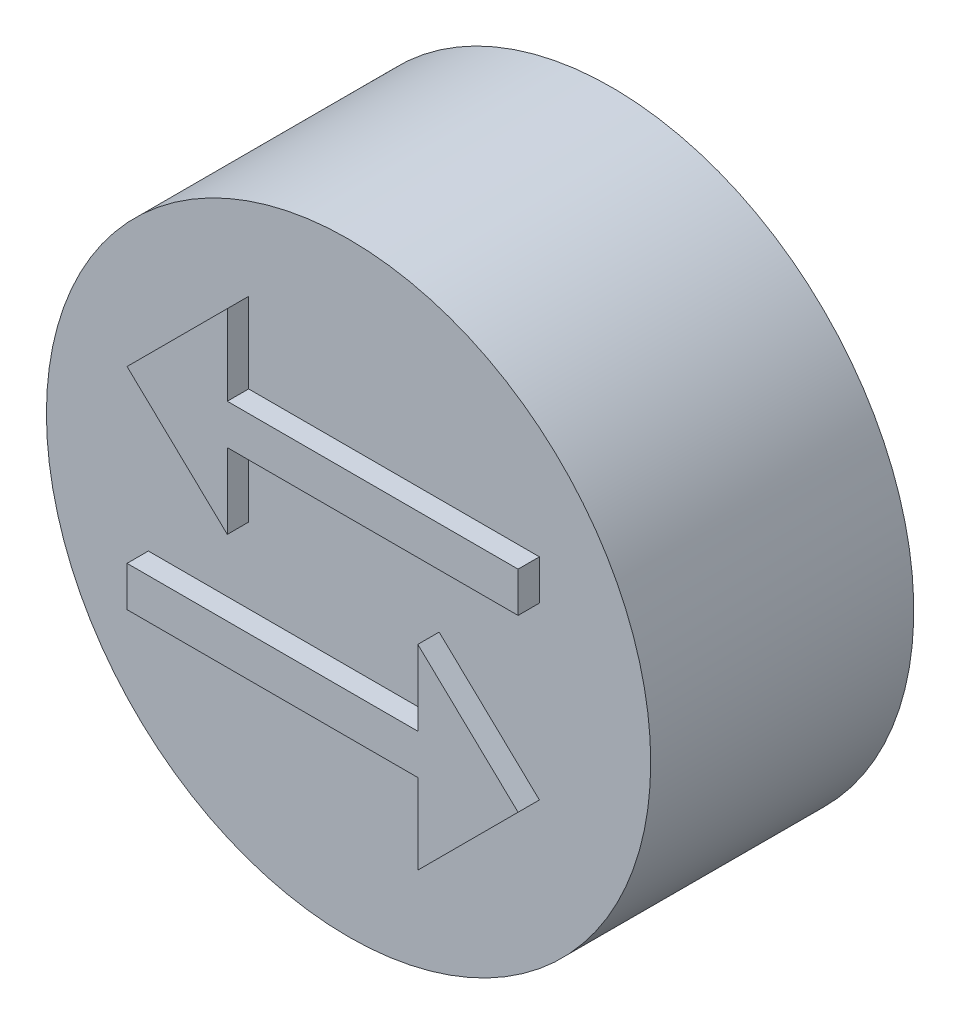
ISO-10303-21;
HEADER;
FILE_DESCRIPTION(('STEP AP214'),'2;1');
FILE_NAME('part.step','',(''),(''),'','','');
FILE_SCHEMA(('AUTOMOTIVE_DESIGN { 1 0 10303 214 1 1 1 1 }'));
ENDSEC;
DATA;
#1=APPLICATION_CONTEXT('core data for automotive mechanical design processes');
#2=APPLICATION_PROTOCOL_DEFINITION('international standard','automotive_design',2000,#1);
#3=PRODUCT_CONTEXT('',#1,'mechanical');
#4=PRODUCT('Part','Part','',(#3));
#5=PRODUCT_RELATED_PRODUCT_CATEGORY('part','',(#4));
#6=PRODUCT_DEFINITION_FORMATION('','',#4);
#7=PRODUCT_DEFINITION_CONTEXT('part definition',#1,'design');
#8=PRODUCT_DEFINITION('design','',#6,#7);
#9=PRODUCT_DEFINITION_SHAPE('','',#8);
#10=(LENGTH_UNIT() NAMED_UNIT(*) SI_UNIT(.MILLI.,.METRE.));
#11=(NAMED_UNIT(*) PLANE_ANGLE_UNIT() SI_UNIT($,.RADIAN.));
#12=(NAMED_UNIT(*) SI_UNIT($,.STERADIAN.) SOLID_ANGLE_UNIT());
#13=UNCERTAINTY_MEASURE_WITH_UNIT(LENGTH_MEASURE(1.E-05),#10,'distance_accuracy_value','');
#14=(GEOMETRIC_REPRESENTATION_CONTEXT(3) GLOBAL_UNCERTAINTY_ASSIGNED_CONTEXT((#13)) GLOBAL_UNIT_ASSIGNED_CONTEXT((#10,
#11,#12)) REPRESENTATION_CONTEXT('',''));
#15=CARTESIAN_POINT('',(0.,0.,0.));
#16=DIRECTION('',(0.,0.,1.));
#17=DIRECTION('',(1.,0.,0.));
#18=AXIS2_PLACEMENT_3D('',#15,#16,#17);
#19=CARTESIAN_POINT('',(0.,0.,-3.));
#20=DIRECTION('',(0.,0.,-1.));
#21=DIRECTION('',(-1.,0.,0.));
#22=AXIS2_PLACEMENT_3D('',#19,#20,#21);
#23=PLANE('',#22);
#24=CARTESIAN_POINT('',(0.,0.,-3.));
#25=DIRECTION('',(0.,0.,-1.));
#26=DIRECTION('',(-1.,0.,0.));
#27=AXIS2_PLACEMENT_3D('',#24,#25,#26);
#28=CIRCLE('',#27,8.5);
#29=CARTESIAN_POINT('',(-8.5,0.,-3.));
#30=VERTEX_POINT('',#29);
#31=EDGE_CURVE('E261',#30,#30,#28,.T.);
#32=ORIENTED_EDGE('',*,*,#31,.T.);
#33=EDGE_LOOP('',(#32));
#34=FACE_BOUND('',#33,.T.);
#35=CARTESIAN_POINT('',(0.,0.,-3.));
#36=DIRECTION('',(0.,0.,-1.));
#37=DIRECTION('',(-1.,0.,0.));
#38=AXIS2_PLACEMENT_3D('',#35,#36,#37);
#39=CIRCLE('',#38,7.5);
#40=CARTESIAN_POINT('',(-7.5,0.,-3.));
#41=VERTEX_POINT('',#40);
#42=EDGE_CURVE('E258',#41,#41,#39,.T.);
#43=ORIENTED_EDGE('',*,*,#42,.F.);
#44=EDGE_LOOP('',(#43));
#45=FACE_BOUND('',#44,.T.);
#46=ADVANCED_FACE('F33',(#34,#45),#23,.T.);
#47=CARTESIAN_POINT('',(0.,0.,-3.));
#48=DIRECTION('',(0.,0.,1.));
#49=DIRECTION('',(1.,0.,0.));
#50=AXIS2_PLACEMENT_3D('',#47,#48,#49);
#51=CYLINDRICAL_SURFACE('',#50,7.5);
#52=ORIENTED_EDGE('',*,*,#42,.T.);
#53=EDGE_LOOP('',(#52));
#54=FACE_BOUND('',#53,.T.);
#55=CARTESIAN_POINT('',(0.,0.,0.));
#56=DIRECTION('',(0.,0.,-1.));
#57=DIRECTION('',(-1.,0.,0.));
#58=AXIS2_PLACEMENT_3D('',#55,#56,#57);
#59=CIRCLE('',#58,7.5);
#60=CARTESIAN_POINT('',(-7.5,0.,0.));
#61=VERTEX_POINT('',#60);
#62=EDGE_CURVE('E235',#61,#61,#59,.T.);
#63=ORIENTED_EDGE('',*,*,#62,.F.);
#64=EDGE_LOOP('',(#63));
#65=FACE_BOUND('',#64,.T.);
#66=ADVANCED_FACE('F289',(#54,#65),#51,.F.);
#67=CARTESIAN_POINT('',(0.,0.,4.4));
#68=DIRECTION('',(0.,0.,1.));
#69=DIRECTION('',(1.,0.,0.));
#70=AXIS2_PLACEMENT_3D('',#67,#68,#69);
#71=PLANE('',#70);
#72=DIRECTION('',(0.724999433594414,-0.688749461914693,0.));
#73=VECTOR('',#72,1.);
#74=CARTESIAN_POINT('',(2.54795517576898,0.199439083173275,4.4));
#75=LINE('',#74,#73);
#76=CARTESIAN_POINT('',(2.54795517576898,0.199439083173275,4.4));
#77=VERTEX_POINT('',#76);
#78=CARTESIAN_POINT('',(5.3684679962818,-2.4800480963139,4.4));
#79=VERTEX_POINT('',#78);
#80=EDGE_CURVE('E173',#77,#79,#75,.T.);
#81=ORIENTED_EDGE('',*,*,#80,.T.);
#82=DIRECTION('',(-0.707106781186548,-0.707106781186547,0.));
#83=VECTOR('',#82,1.);
#84=CARTESIAN_POINT('',(5.3684679962818,-2.4800480963139,4.4));
#85=LINE('',#84,#83);
#86=CARTESIAN_POINT('',(2.54795517576898,-5.30056091682672,4.4));
#87=VERTEX_POINT('',#86);
#88=EDGE_CURVE('E139',#79,#87,#85,.T.);
#89=ORIENTED_EDGE('',*,*,#88,.T.);
#90=DIRECTION('',(0.,1.,0.));
#91=VECTOR('',#90,1.);
#92=CARTESIAN_POINT('',(2.54795517576898,-5.30056091682672,4.4));
#93=LINE('',#92,#91);
#94=CARTESIAN_POINT('',(2.54795517576898,-3.04415066041647,4.4));
#95=VERTEX_POINT('',#94);
#96=EDGE_CURVE('E176',#87,#95,#93,.T.);
#97=ORIENTED_EDGE('',*,*,#96,.T.);
#98=DIRECTION('',(-1.,0.,0.));
#99=VECTOR('',#98,1.);
#100=CARTESIAN_POINT('',(2.54795517576898,-3.04415066041647,4.4));
#101=LINE('',#100,#99);
#102=CARTESIAN_POINT('',(-5.6315320037182,-3.04415066041647,4.4));
#103=VERTEX_POINT('',#102);
#104=EDGE_CURVE('E178',#95,#103,#101,.T.);
#105=ORIENTED_EDGE('',*,*,#104,.T.);
#106=DIRECTION('',(0.,1.,0.));
#107=VECTOR('',#106,1.);
#108=CARTESIAN_POINT('',(-5.6315320037182,-3.04415066041647,4.4));
#109=LINE('',#108,#107);
#110=CARTESIAN_POINT('',(-5.6315320037182,-1.91594553221134,4.4));
#111=VERTEX_POINT('',#110);
#112=EDGE_CURVE('E180',#103,#111,#109,.T.);
#113=ORIENTED_EDGE('',*,*,#112,.T.);
#114=DIRECTION('',(1.,0.,0.));
#115=VECTOR('',#114,1.);
#116=CARTESIAN_POINT('',(-5.6315320037182,-1.91594553221134,4.4));
#117=LINE('',#116,#115);
#118=CARTESIAN_POINT('',(2.54795517576898,-1.91594553221134,4.4));
#119=VERTEX_POINT('',#118);
#120=EDGE_CURVE('E53',#111,#119,#117,.T.);
#121=ORIENTED_EDGE('',*,*,#120,.T.);
#122=DIRECTION('',(0.,1.,0.));
#123=VECTOR('',#122,1.);
#124=CARTESIAN_POINT('',(2.54795517576898,-1.91594553221134,4.4));
#125=LINE('',#124,#123);
#126=EDGE_CURVE('E48',#119,#77,#125,.T.);
#127=ORIENTED_EDGE('',*,*,#126,.T.);
#128=EDGE_LOOP('',(#81,#89,#97,#105,#113,#121,#127));
#129=FACE_BOUND('',#128,.T.);
#130=DIRECTION('',(-0.724999433594414,0.688749461914693,0.));
#131=VECTOR('',#130,1.);
#132=CARTESIAN_POINT('',(-2.81101918320538,0.199439083173275,4.4));
#133=LINE('',#132,#131);
#134=CARTESIAN_POINT('',(-2.81101918320538,0.199439083173275,4.4));
#135=VERTEX_POINT('',#134);
#136=CARTESIAN_POINT('',(-5.6315320037182,2.87892626266045,4.4));
#137=VERTEX_POINT('',#136);
#138=EDGE_CURVE('E184',#135,#137,#133,.T.);
#139=ORIENTED_EDGE('',*,*,#138,.T.);
#140=DIRECTION('',(0.707106781186548,0.707106781186548,0.));
#141=VECTOR('',#140,1.);
#142=CARTESIAN_POINT('',(-5.6315320037182,2.87892626266045,4.4));
#143=LINE('',#142,#141);
#144=CARTESIAN_POINT('',(-2.81101918320538,5.69943908317327,4.4));
#145=VERTEX_POINT('',#144);
#146=EDGE_CURVE('E221',#137,#145,#143,.T.);
#147=ORIENTED_EDGE('',*,*,#146,.T.);
#148=DIRECTION('',(0.,-1.,0.));
#149=VECTOR('',#148,1.);
#150=CARTESIAN_POINT('',(-2.81101918320538,5.69943908317327,4.4));
#151=LINE('',#150,#149);
#152=CARTESIAN_POINT('',(-2.81101918320538,3.44302882676302,4.4));
#153=VERTEX_POINT('',#152);
#154=EDGE_CURVE('E223',#145,#153,#151,.T.);
#155=ORIENTED_EDGE('',*,*,#154,.T.);
#156=DIRECTION('',(1.,0.,0.));
#157=VECTOR('',#156,1.);
#158=CARTESIAN_POINT('',(-2.81101918320538,3.44302882676302,4.4));
#159=LINE('',#158,#157);
#160=CARTESIAN_POINT('',(5.3684679962818,3.44302882676302,4.4));
#161=VERTEX_POINT('',#160);
#162=EDGE_CURVE('E225',#153,#161,#159,.T.);
#163=ORIENTED_EDGE('',*,*,#162,.T.);
#164=DIRECTION('',(0.,-1.,0.));
#165=VECTOR('',#164,1.);
#166=CARTESIAN_POINT('',(5.3684679962818,3.44302882676302,4.4));
#167=LINE('',#166,#165);
#168=CARTESIAN_POINT('',(5.3684679962818,2.31482369855789,4.4));
#169=VERTEX_POINT('',#168);
#170=EDGE_CURVE('E227',#161,#169,#167,.T.);
#171=ORIENTED_EDGE('',*,*,#170,.T.);
#172=DIRECTION('',(-1.,0.,0.));
#173=VECTOR('',#172,1.);
#174=CARTESIAN_POINT('',(5.3684679962818,2.31482369855789,4.4));
#175=LINE('',#174,#173);
#176=CARTESIAN_POINT('',(-2.81101918320538,2.31482369855789,4.4));
#177=VERTEX_POINT('',#176);
#178=EDGE_CURVE('E229',#169,#177,#175,.T.);
#179=ORIENTED_EDGE('',*,*,#178,.T.);
#180=DIRECTION('',(0.,-1.,0.));
#181=VECTOR('',#180,1.);
#182=CARTESIAN_POINT('',(-2.81101918320538,2.31482369855789,4.4));
#183=LINE('',#182,#181);
#184=EDGE_CURVE('E201',#177,#135,#183,.T.);
#185=ORIENTED_EDGE('',*,*,#184,.T.);
#186=EDGE_LOOP('',(#139,#147,#155,#163,#171,#179,#185));
#187=FACE_BOUND('',#186,.T.);
#188=CARTESIAN_POINT('',(0.,0.,4.4));
#189=DIRECTION('',(0.,0.,1.));
#190=DIRECTION('',(1.,0.,0.));
#191=AXIS2_PLACEMENT_3D('',#188,#189,#190);
#192=CIRCLE('',#191,8.5);
#193=CARTESIAN_POINT('',(8.5,0.,4.4));
#194=VERTEX_POINT('',#193);
#195=EDGE_CURVE('E11',#194,#194,#192,.T.);
#196=ORIENTED_EDGE('',*,*,#195,.T.);
#197=EDGE_LOOP('',(#196));
#198=FACE_BOUND('',#197,.T.);
#199=ADVANCED_FACE('F284',(#129,#187,#198),#71,.T.);
#200=CARTESIAN_POINT('',(0.,0.,4.4));
#201=DIRECTION('',(0.,0.,-1.));
#202=DIRECTION('',(-1.,0.,0.));
#203=AXIS2_PLACEMENT_3D('',#200,#201,#202);
#204=CYLINDRICAL_SURFACE('',#203,8.5);
#205=ORIENTED_EDGE('',*,*,#195,.F.);
#206=EDGE_LOOP('',(#205));
#207=FACE_BOUND('',#206,.T.);
#208=ORIENTED_EDGE('',*,*,#31,.F.);
#209=EDGE_LOOP('',(#208));
#210=FACE_BOUND('',#209,.T.);
#211=ADVANCED_FACE('F35',(#207,#210),#204,.T.);
#212=CARTESIAN_POINT('',(0.,0.,1.69999999999998));
#213=DIRECTION('',(0.,0.,-1.));
#214=DIRECTION('',(-1.,0.,0.));
#215=AXIS2_PLACEMENT_3D('',#212,#213,#214);
#216=CONICAL_SURFACE('',#215,5.8,0.785398163397454);
#217=ORIENTED_EDGE('',*,*,#62,.T.);
#218=EDGE_LOOP('',(#217));
#219=FACE_BOUND('',#218,.T.);
#220=CARTESIAN_POINT('',(0.,0.,1.69999999999998));
#221=DIRECTION('',(0.,0.,-1.));
#222=DIRECTION('',(-1.,0.,0.));
#223=AXIS2_PLACEMENT_3D('',#220,#221,#222);
#224=CIRCLE('',#223,5.8);
#225=CARTESIAN_POINT('',(-5.8,0.,1.69999999999998));
#226=VERTEX_POINT('',#225);
#227=EDGE_CURVE('E255',#226,#226,#224,.T.);
#228=ORIENTED_EDGE('',*,*,#227,.F.);
#229=EDGE_LOOP('',(#228));
#230=FACE_BOUND('',#229,.T.);
#231=ADVANCED_FACE('F275',(#219,#230),#216,.F.);
#232=CARTESIAN_POINT('',(0.,0.,4.));
#233=DIRECTION('',(0.,0.,-1.));
#234=DIRECTION('',(-1.,0.,0.));
#235=AXIS2_PLACEMENT_3D('',#232,#233,#234);
#236=PLANE('',#235);
#237=CARTESIAN_POINT('',(0.,0.,4.));
#238=DIRECTION('',(0.,0.,-1.));
#239=DIRECTION('',(-1.,0.,0.));
#240=AXIS2_PLACEMENT_3D('',#237,#238,#239);
#241=CIRCLE('',#240,5.8);
#242=CARTESIAN_POINT('',(-5.8,0.,4.));
#243=VERTEX_POINT('',#242);
#244=EDGE_CURVE('E41',#243,#243,#241,.T.);
#245=ORIENTED_EDGE('',*,*,#244,.T.);
#246=EDGE_LOOP('',(#245));
#247=FACE_BOUND('',#246,.T.);
#248=ADVANCED_FACE('F266',(#247),#236,.T.);
#249=CARTESIAN_POINT('',(0.,0.,4.));
#250=DIRECTION('',(0.,0.,-1.));
#251=DIRECTION('',(-1.,0.,0.));
#252=AXIS2_PLACEMENT_3D('',#249,#250,#251);
#253=CYLINDRICAL_SURFACE('',#252,5.8);
#254=ORIENTED_EDGE('',*,*,#244,.F.);
#255=EDGE_LOOP('',(#254));
#256=FACE_BOUND('',#255,.T.);
#257=ORIENTED_EDGE('',*,*,#227,.T.);
#258=EDGE_LOOP('',(#257));
#259=FACE_BOUND('',#258,.T.);
#260=ADVANCED_FACE('F268',(#256,#259),#253,.F.);
#261=CARTESIAN_POINT('',(-2.81101918320538,0.199439083173275,5.));
#262=DIRECTION('',(-0.688749461914693,-0.724999433594414,0.));
#263=DIRECTION('',(0.724999433594414,-0.688749461914693,0.));
#264=AXIS2_PLACEMENT_3D('',#261,#262,#263);
#265=PLANE('',#264);
#266=ORIENTED_EDGE('',*,*,#138,.F.);
#267=DIRECTION('',(0.,0.,-1.));
#268=VECTOR('',#267,1.);
#269=CARTESIAN_POINT('',(-2.81101918320538,0.199439083173275,5.));
#270=LINE('',#269,#268);
#271=CARTESIAN_POINT('',(-2.81101918320538,0.199439083173275,5.));
#272=VERTEX_POINT('',#271);
#273=EDGE_CURVE('E232',#272,#135,#270,.T.);
#274=ORIENTED_EDGE('',*,*,#273,.F.);
#275=DIRECTION('',(-0.724999433594414,0.688749461914693,0.));
#276=VECTOR('',#275,1.);
#277=CARTESIAN_POINT('',(-2.81101918320538,0.199439083173275,5.));
#278=LINE('',#277,#276);
#279=CARTESIAN_POINT('',(-5.6315320037182,2.87892626266045,5.));
#280=VERTEX_POINT('',#279);
#281=EDGE_CURVE('E197',#272,#280,#278,.T.);
#282=ORIENTED_EDGE('',*,*,#281,.T.);
#283=DIRECTION('',(0.,0.,-1.));
#284=VECTOR('',#283,1.);
#285=CARTESIAN_POINT('',(-5.6315320037182,2.87892626266045,5.));
#286=LINE('',#285,#284);
#287=EDGE_CURVE('E219',#280,#137,#286,.T.);
#288=ORIENTED_EDGE('',*,*,#287,.T.);
#289=EDGE_LOOP('',(#266,#274,#282,#288));
#290=FACE_BOUND('',#289,.T.);
#291=ADVANCED_FACE('F271',(#290),#265,.T.);
#292=CARTESIAN_POINT('',(-2.81101918320538,2.31482369855789,5.));
#293=DIRECTION('',(1.,0.,0.));
#294=DIRECTION('',(0.,0.,-1.));
#295=AXIS2_PLACEMENT_3D('',#292,#293,#294);
#296=PLANE('',#295);
#297=ORIENTED_EDGE('',*,*,#184,.F.);
#298=DIRECTION('',(0.,0.,-1.));
#299=VECTOR('',#298,1.);
#300=CARTESIAN_POINT('',(-2.81101918320538,2.31482369855789,5.));
#301=LINE('',#300,#299);
#302=CARTESIAN_POINT('',(-2.81101918320538,2.31482369855789,5.));
#303=VERTEX_POINT('',#302);
#304=EDGE_CURVE('E236',#303,#177,#301,.T.);
#305=ORIENTED_EDGE('',*,*,#304,.F.);
#306=DIRECTION('',(0.,-1.,0.));
#307=VECTOR('',#306,1.);
#308=CARTESIAN_POINT('',(-2.81101918320538,2.31482369855789,5.));
#309=LINE('',#308,#307);
#310=EDGE_CURVE('E216',#303,#272,#309,.T.);
#311=ORIENTED_EDGE('',*,*,#310,.T.);
#312=ORIENTED_EDGE('',*,*,#273,.T.);
#313=EDGE_LOOP('',(#297,#305,#311,#312));
#314=FACE_BOUND('',#313,.T.);
#315=ADVANCED_FACE('F331',(#314),#296,.T.);
#316=CARTESIAN_POINT('',(5.3684679962818,2.31482369855789,5.));
#317=DIRECTION('',(0.,-1.,0.));
#318=DIRECTION('',(0.,0.,-1.));
#319=AXIS2_PLACEMENT_3D('',#316,#317,#318);
#320=PLANE('',#319);
#321=ORIENTED_EDGE('',*,*,#178,.F.);
#322=DIRECTION('',(0.,0.,-1.));
#323=VECTOR('',#322,1.);
#324=CARTESIAN_POINT('',(5.3684679962818,2.31482369855789,5.));
#325=LINE('',#324,#323);
#326=CARTESIAN_POINT('',(5.3684679962818,2.31482369855789,5.));
#327=VERTEX_POINT('',#326);
#328=EDGE_CURVE('E239',#327,#169,#325,.T.);
#329=ORIENTED_EDGE('',*,*,#328,.F.);
#330=DIRECTION('',(-1.,0.,0.));
#331=VECTOR('',#330,1.);
#332=CARTESIAN_POINT('',(5.3684679962818,2.31482369855789,5.));
#333=LINE('',#332,#331);
#334=EDGE_CURVE('E213',#327,#303,#333,.T.);
#335=ORIENTED_EDGE('',*,*,#334,.T.);
#336=ORIENTED_EDGE('',*,*,#304,.T.);
#337=EDGE_LOOP('',(#321,#329,#335,#336));
#338=FACE_BOUND('',#337,.T.);
#339=ADVANCED_FACE('F328',(#338),#320,.T.);
#340=CARTESIAN_POINT('',(5.3684679962818,3.44302882676302,5.));
#341=DIRECTION('',(1.,0.,0.));
#342=DIRECTION('',(0.,0.,-1.));
#343=AXIS2_PLACEMENT_3D('',#340,#341,#342);
#344=PLANE('',#343);
#345=ORIENTED_EDGE('',*,*,#170,.F.);
#346=DIRECTION('',(0.,0.,-1.));
#347=VECTOR('',#346,1.);
#348=CARTESIAN_POINT('',(5.3684679962818,3.44302882676302,5.));
#349=LINE('',#348,#347);
#350=CARTESIAN_POINT('',(5.3684679962818,3.44302882676302,5.));
#351=VERTEX_POINT('',#350);
#352=EDGE_CURVE('E242',#351,#161,#349,.T.);
#353=ORIENTED_EDGE('',*,*,#352,.F.);
#354=DIRECTION('',(0.,-1.,0.));
#355=VECTOR('',#354,1.);
#356=CARTESIAN_POINT('',(5.3684679962818,3.44302882676302,5.));
#357=LINE('',#356,#355);
#358=EDGE_CURVE('E210',#351,#327,#357,.T.);
#359=ORIENTED_EDGE('',*,*,#358,.T.);
#360=ORIENTED_EDGE('',*,*,#328,.T.);
#361=EDGE_LOOP('',(#345,#353,#359,#360));
#362=FACE_BOUND('',#361,.T.);
#363=ADVANCED_FACE('F324',(#362),#344,.T.);
#364=CARTESIAN_POINT('',(-2.81101918320538,3.44302882676302,5.));
#365=DIRECTION('',(0.,1.,0.));
#366=DIRECTION('',(0.,0.,1.));
#367=AXIS2_PLACEMENT_3D('',#364,#365,#366);
#368=PLANE('',#367);
#369=ORIENTED_EDGE('',*,*,#162,.F.);
#370=DIRECTION('',(0.,0.,-1.));
#371=VECTOR('',#370,1.);
#372=CARTESIAN_POINT('',(-2.81101918320538,3.44302882676302,5.));
#373=LINE('',#372,#371);
#374=CARTESIAN_POINT('',(-2.81101918320538,3.44302882676302,5.));
#375=VERTEX_POINT('',#374);
#376=EDGE_CURVE('E245',#375,#153,#373,.T.);
#377=ORIENTED_EDGE('',*,*,#376,.F.);
#378=DIRECTION('',(1.,0.,0.));
#379=VECTOR('',#378,1.);
#380=CARTESIAN_POINT('',(-2.81101918320538,3.44302882676302,5.));
#381=LINE('',#380,#379);
#382=EDGE_CURVE('E207',#375,#351,#381,.T.);
#383=ORIENTED_EDGE('',*,*,#382,.T.);
#384=ORIENTED_EDGE('',*,*,#352,.T.);
#385=EDGE_LOOP('',(#369,#377,#383,#384));
#386=FACE_BOUND('',#385,.T.);
#387=ADVANCED_FACE('F320',(#386),#368,.T.);
#388=CARTESIAN_POINT('',(-2.81101918320538,5.69943908317327,5.));
#389=DIRECTION('',(1.,0.,0.));
#390=DIRECTION('',(0.,0.,-1.));
#391=AXIS2_PLACEMENT_3D('',#388,#389,#390);
#392=PLANE('',#391);
#393=ORIENTED_EDGE('',*,*,#154,.F.);
#394=DIRECTION('',(0.,0.,-1.));
#395=VECTOR('',#394,1.);
#396=CARTESIAN_POINT('',(-2.81101918320538,5.69943908317327,5.));
#397=LINE('',#396,#395);
#398=CARTESIAN_POINT('',(-2.81101918320538,5.69943908317327,5.));
#399=VERTEX_POINT('',#398);
#400=EDGE_CURVE('E248',#399,#145,#397,.T.);
#401=ORIENTED_EDGE('',*,*,#400,.F.);
#402=DIRECTION('',(0.,-1.,0.));
#403=VECTOR('',#402,1.);
#404=CARTESIAN_POINT('',(-2.81101918320538,5.69943908317327,5.));
#405=LINE('',#404,#403);
#406=EDGE_CURVE('E204',#399,#375,#405,.T.);
#407=ORIENTED_EDGE('',*,*,#406,.T.);
#408=ORIENTED_EDGE('',*,*,#376,.T.);
#409=EDGE_LOOP('',(#393,#401,#407,#408));
#410=FACE_BOUND('',#409,.T.);
#411=ADVANCED_FACE('F316',(#410),#392,.T.);
#412=CARTESIAN_POINT('',(-5.6315320037182,2.87892626266045,5.));
#413=DIRECTION('',(-0.707106781186548,0.707106781186547,0.));
#414=DIRECTION('',(-0.707106781186547,-0.707106781186548,0.));
#415=AXIS2_PLACEMENT_3D('',#412,#413,#414);
#416=PLANE('',#415);
#417=ORIENTED_EDGE('',*,*,#146,.F.);
#418=ORIENTED_EDGE('',*,*,#287,.F.);
#419=DIRECTION('',(0.707106781186548,0.707106781186548,0.));
#420=VECTOR('',#419,1.);
#421=CARTESIAN_POINT('',(-5.6315320037182,2.87892626266045,5.));
#422=LINE('',#421,#420);
#423=EDGE_CURVE('E200',#280,#399,#422,.T.);
#424=ORIENTED_EDGE('',*,*,#423,.T.);
#425=ORIENTED_EDGE('',*,*,#400,.T.);
#426=EDGE_LOOP('',(#417,#418,#424,#425));
#427=FACE_BOUND('',#426,.T.);
#428=ADVANCED_FACE('F312',(#427),#416,.T.);
#429=CARTESIAN_POINT('',(0.,0.,5.));
#430=DIRECTION('',(0.,0.,-1.));
#431=DIRECTION('',(-1.,0.,0.));
#432=AXIS2_PLACEMENT_3D('',#429,#430,#431);
#433=PLANE('',#432);
#434=ORIENTED_EDGE('',*,*,#281,.F.);
#435=ORIENTED_EDGE('',*,*,#310,.F.);
#436=ORIENTED_EDGE('',*,*,#334,.F.);
#437=ORIENTED_EDGE('',*,*,#358,.F.);
#438=ORIENTED_EDGE('',*,*,#382,.F.);
#439=ORIENTED_EDGE('',*,*,#406,.F.);
#440=ORIENTED_EDGE('',*,*,#423,.F.);
#441=EDGE_LOOP('',(#434,#435,#436,#437,#438,#439,#440));
#442=FACE_BOUND('',#441,.T.);
#443=ADVANCED_FACE('F333',(#442),#433,.F.);
#444=CARTESIAN_POINT('',(2.54795517576898,0.199439083173275,5.));
#445=DIRECTION('',(0.688749461914693,0.724999433594414,0.));
#446=DIRECTION('',(-0.724999433594414,0.688749461914693,0.));
#447=AXIS2_PLACEMENT_3D('',#444,#445,#446);
#448=PLANE('',#447);
#449=ORIENTED_EDGE('',*,*,#80,.F.);
#450=DIRECTION('',(0.,0.,-1.));
#451=VECTOR('',#450,1.);
#452=CARTESIAN_POINT('',(2.54795517576898,0.199439083173275,5.));
#453=LINE('',#452,#451);
#454=CARTESIAN_POINT('',(2.54795517576898,0.199439083173275,5.));
#455=VERTEX_POINT('',#454);
#456=EDGE_CURVE('E158',#455,#77,#453,.T.);
#457=ORIENTED_EDGE('',*,*,#456,.F.);
#458=DIRECTION('',(0.724999433594414,-0.688749461914693,0.));
#459=VECTOR('',#458,1.);
#460=CARTESIAN_POINT('',(2.54795517576898,0.199439083173275,5.));
#461=LINE('',#460,#459);
#462=CARTESIAN_POINT('',(5.3684679962818,-2.4800480963139,5.));
#463=VERTEX_POINT('',#462);
#464=EDGE_CURVE('E151',#455,#463,#461,.T.);
#465=ORIENTED_EDGE('',*,*,#464,.T.);
#466=DIRECTION('',(0.,0.,-1.));
#467=VECTOR('',#466,1.);
#468=CARTESIAN_POINT('',(5.3684679962818,-2.4800480963139,5.));
#469=LINE('',#468,#467);
#470=EDGE_CURVE('E134',#463,#79,#469,.T.);
#471=ORIENTED_EDGE('',*,*,#470,.T.);
#472=EDGE_LOOP('',(#449,#457,#465,#471));
#473=FACE_BOUND('',#472,.T.);
#474=ADVANCED_FACE('F157',(#473),#448,.T.);
#475=CARTESIAN_POINT('',(2.54795517576898,-1.91594553221134,5.));
#476=DIRECTION('',(-1.,0.,0.));
#477=DIRECTION('',(0.,0.,1.));
#478=AXIS2_PLACEMENT_3D('',#475,#476,#477);
#479=PLANE('',#478);
#480=ORIENTED_EDGE('',*,*,#126,.F.);
#481=DIRECTION('',(0.,0.,-1.));
#482=VECTOR('',#481,1.);
#483=CARTESIAN_POINT('',(2.54795517576898,-1.91594553221134,5.));
#484=LINE('',#483,#482);
#485=CARTESIAN_POINT('',(2.54795517576898,-1.91594553221134,5.));
#486=VERTEX_POINT('',#485);
#487=EDGE_CURVE('E185',#486,#119,#484,.T.);
#488=ORIENTED_EDGE('',*,*,#487,.F.);
#489=DIRECTION('',(0.,1.,0.));
#490=VECTOR('',#489,1.);
#491=CARTESIAN_POINT('',(2.54795517576898,-1.91594553221134,5.));
#492=LINE('',#491,#490);
#493=EDGE_CURVE('E144',#486,#455,#492,.T.);
#494=ORIENTED_EDGE('',*,*,#493,.T.);
#495=ORIENTED_EDGE('',*,*,#456,.T.);
#496=EDGE_LOOP('',(#480,#488,#494,#495));
#497=FACE_BOUND('',#496,.T.);
#498=ADVANCED_FACE('F340',(#497),#479,.T.);
#499=CARTESIAN_POINT('',(-5.6315320037182,-1.91594553221134,5.));
#500=DIRECTION('',(0.,1.,0.));
#501=DIRECTION('',(0.,0.,1.));
#502=AXIS2_PLACEMENT_3D('',#499,#500,#501);
#503=PLANE('',#502);
#504=ORIENTED_EDGE('',*,*,#120,.F.);
#505=DIRECTION('',(0.,0.,-1.));
#506=VECTOR('',#505,1.);
#507=CARTESIAN_POINT('',(-5.6315320037182,-1.91594553221134,5.));
#508=LINE('',#507,#506);
#509=CARTESIAN_POINT('',(-5.6315320037182,-1.91594553221134,5.));
#510=VERTEX_POINT('',#509);
#511=EDGE_CURVE('E187',#510,#111,#508,.T.);
#512=ORIENTED_EDGE('',*,*,#511,.F.);
#513=DIRECTION('',(1.,0.,0.));
#514=VECTOR('',#513,1.);
#515=CARTESIAN_POINT('',(-5.6315320037182,-1.91594553221134,5.));
#516=LINE('',#515,#514);
#517=EDGE_CURVE('E169',#510,#486,#516,.T.);
#518=ORIENTED_EDGE('',*,*,#517,.T.);
#519=ORIENTED_EDGE('',*,*,#487,.T.);
#520=EDGE_LOOP('',(#504,#512,#518,#519));
#521=FACE_BOUND('',#520,.T.);
#522=ADVANCED_FACE('F404',(#521),#503,.T.);
#523=CARTESIAN_POINT('',(-5.6315320037182,-3.04415066041647,5.));
#524=DIRECTION('',(-1.,0.,0.));
#525=DIRECTION('',(0.,0.,1.));
#526=AXIS2_PLACEMENT_3D('',#523,#524,#525);
#527=PLANE('',#526);
#528=ORIENTED_EDGE('',*,*,#112,.F.);
#529=DIRECTION('',(0.,0.,-1.));
#530=VECTOR('',#529,1.);
#531=CARTESIAN_POINT('',(-5.6315320037182,-3.04415066041647,5.));
#532=LINE('',#531,#530);
#533=CARTESIAN_POINT('',(-5.6315320037182,-3.04415066041647,5.));
#534=VERTEX_POINT('',#533);
#535=EDGE_CURVE('E190',#534,#103,#532,.T.);
#536=ORIENTED_EDGE('',*,*,#535,.F.);
#537=DIRECTION('',(0.,1.,0.));
#538=VECTOR('',#537,1.);
#539=CARTESIAN_POINT('',(-5.6315320037182,-3.04415066041647,5.));
#540=LINE('',#539,#538);
#541=EDGE_CURVE('E166',#534,#510,#540,.T.);
#542=ORIENTED_EDGE('',*,*,#541,.T.);
#543=ORIENTED_EDGE('',*,*,#511,.T.);
#544=EDGE_LOOP('',(#528,#536,#542,#543));
#545=FACE_BOUND('',#544,.T.);
#546=ADVANCED_FACE('F414',(#545),#527,.T.);
#547=CARTESIAN_POINT('',(2.54795517576898,-3.04415066041647,5.));
#548=DIRECTION('',(0.,-1.,0.));
#549=DIRECTION('',(0.,0.,-1.));
#550=AXIS2_PLACEMENT_3D('',#547,#548,#549);
#551=PLANE('',#550);
#552=ORIENTED_EDGE('',*,*,#104,.F.);
#553=DIRECTION('',(0.,0.,-1.));
#554=VECTOR('',#553,1.);
#555=CARTESIAN_POINT('',(2.54795517576898,-3.04415066041647,5.));
#556=LINE('',#555,#554);
#557=CARTESIAN_POINT('',(2.54795517576898,-3.04415066041647,5.));
#558=VERTEX_POINT('',#557);
#559=EDGE_CURVE('E193',#558,#95,#556,.T.);
#560=ORIENTED_EDGE('',*,*,#559,.F.);
#561=DIRECTION('',(-1.,0.,0.));
#562=VECTOR('',#561,1.);
#563=CARTESIAN_POINT('',(2.54795517576898,-3.04415066041647,5.));
#564=LINE('',#563,#562);
#565=EDGE_CURVE('E163',#558,#534,#564,.T.);
#566=ORIENTED_EDGE('',*,*,#565,.T.);
#567=ORIENTED_EDGE('',*,*,#535,.T.);
#568=EDGE_LOOP('',(#552,#560,#566,#567));
#569=FACE_BOUND('',#568,.T.);
#570=ADVANCED_FACE('F424',(#569),#551,.T.);
#571=CARTESIAN_POINT('',(2.54795517576898,-5.30056091682672,5.));
#572=DIRECTION('',(-1.,0.,0.));
#573=DIRECTION('',(0.,0.,1.));
#574=AXIS2_PLACEMENT_3D('',#571,#572,#573);
#575=PLANE('',#574);
#576=ORIENTED_EDGE('',*,*,#96,.F.);
#577=DIRECTION('',(0.,0.,-1.));
#578=VECTOR('',#577,1.);
#579=CARTESIAN_POINT('',(2.54795517576898,-5.30056091682672,5.));
#580=LINE('',#579,#578);
#581=CARTESIAN_POINT('',(2.54795517576898,-5.30056091682672,5.));
#582=VERTEX_POINT('',#581);
#583=EDGE_CURVE('E143',#582,#87,#580,.T.);
#584=ORIENTED_EDGE('',*,*,#583,.F.);
#585=DIRECTION('',(0.,1.,0.));
#586=VECTOR('',#585,1.);
#587=CARTESIAN_POINT('',(2.54795517576898,-5.30056091682672,5.));
#588=LINE('',#587,#586);
#589=EDGE_CURVE('E155',#582,#558,#588,.T.);
#590=ORIENTED_EDGE('',*,*,#589,.T.);
#591=ORIENTED_EDGE('',*,*,#559,.T.);
#592=EDGE_LOOP('',(#576,#584,#590,#591));
#593=FACE_BOUND('',#592,.T.);
#594=ADVANCED_FACE('F434',(#593),#575,.T.);
#595=CARTESIAN_POINT('',(5.3684679962818,-2.4800480963139,5.));
#596=DIRECTION('',(0.707106781186547,-0.707106781186548,0.));
#597=DIRECTION('',(0.707106781186548,0.707106781186547,0.));
#598=AXIS2_PLACEMENT_3D('',#595,#596,#597);
#599=PLANE('',#598);
#600=ORIENTED_EDGE('',*,*,#88,.F.);
#601=ORIENTED_EDGE('',*,*,#470,.F.);
#602=DIRECTION('',(-0.707106781186548,-0.707106781186547,0.));
#603=VECTOR('',#602,1.);
#604=CARTESIAN_POINT('',(5.3684679962818,-2.4800480963139,5.));
#605=LINE('',#604,#603);
#606=EDGE_CURVE('E138',#463,#582,#605,.T.);
#607=ORIENTED_EDGE('',*,*,#606,.T.);
#608=ORIENTED_EDGE('',*,*,#583,.T.);
#609=EDGE_LOOP('',(#600,#601,#607,#608));
#610=FACE_BOUND('',#609,.T.);
#611=ADVANCED_FACE('F136',(#610),#599,.T.);
#612=CARTESIAN_POINT('',(0.,0.,5.));
#613=DIRECTION('',(0.,0.,-1.));
#614=DIRECTION('',(-1.,0.,0.));
#615=AXIS2_PLACEMENT_3D('',#612,#613,#614);
#616=PLANE('',#615);
#617=ORIENTED_EDGE('',*,*,#464,.F.);
#618=ORIENTED_EDGE('',*,*,#493,.F.);
#619=ORIENTED_EDGE('',*,*,#517,.F.);
#620=ORIENTED_EDGE('',*,*,#541,.F.);
#621=ORIENTED_EDGE('',*,*,#565,.F.);
#622=ORIENTED_EDGE('',*,*,#589,.F.);
#623=ORIENTED_EDGE('',*,*,#606,.F.);
#624=EDGE_LOOP('',(#617,#618,#619,#620,#621,#622,#623));
#625=FACE_BOUND('',#624,.T.);
#626=ADVANCED_FACE('F149',(#625),#616,.F.);
#627=CLOSED_SHELL('',(#46,#66,#199,#211,#231,#248,#260,#291,#315,#339,#363,#387,#411,#428,#443,
#474,#498,#522,#546,#570,#594,#611,#626));
#628=MANIFOLD_SOLID_BREP('B2',#627);
#629=ADVANCED_BREP_SHAPE_REPRESENTATION('',(#18,#628),#14);
#630=SHAPE_DEFINITION_REPRESENTATION(#9,#629);
ENDSEC;
END-ISO-10303-21;
